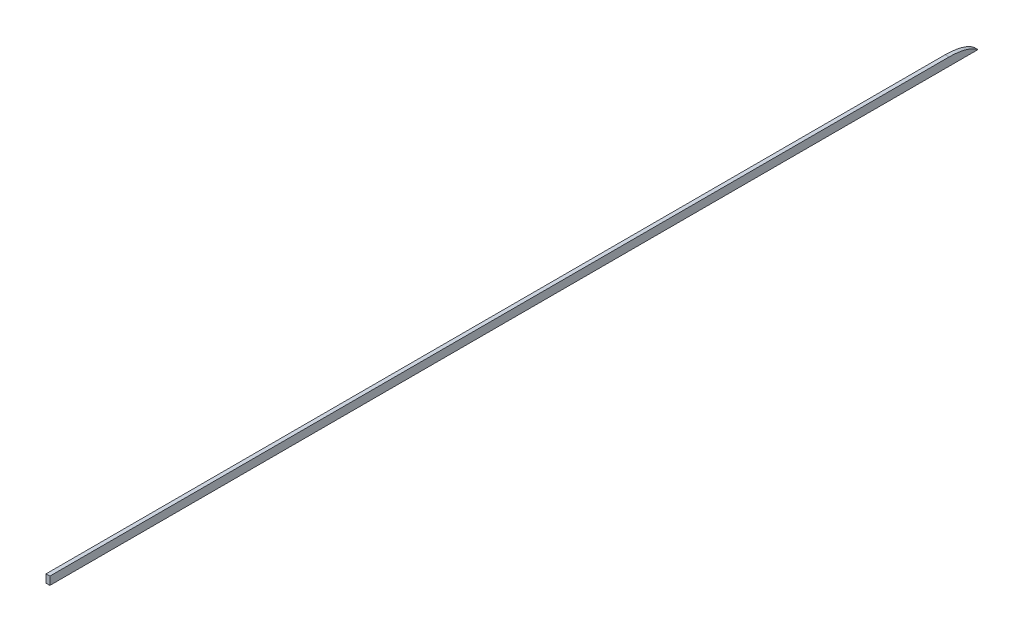
ISO-10303-21;
HEADER;
FILE_DESCRIPTION(('STEP AP214'),'2;1');
FILE_NAME('part.step','',(''),(''),'','','');
FILE_SCHEMA(('AUTOMOTIVE_DESIGN { 1 0 10303 214 1 1 1 1 }'));
ENDSEC;
DATA;
#1=APPLICATION_CONTEXT('core data for automotive mechanical design processes');
#2=APPLICATION_PROTOCOL_DEFINITION('international standard','automotive_design',2000,#1);
#3=PRODUCT_CONTEXT('',#1,'mechanical');
#4=PRODUCT('Part','Part','',(#3));
#5=PRODUCT_RELATED_PRODUCT_CATEGORY('part','',(#4));
#6=PRODUCT_DEFINITION_FORMATION('','',#4);
#7=PRODUCT_DEFINITION_CONTEXT('part definition',#1,'design');
#8=PRODUCT_DEFINITION('design','',#6,#7);
#9=PRODUCT_DEFINITION_SHAPE('','',#8);
#10=(LENGTH_UNIT() NAMED_UNIT(*) SI_UNIT(.MILLI.,.METRE.));
#11=(NAMED_UNIT(*) PLANE_ANGLE_UNIT() SI_UNIT($,.RADIAN.));
#12=(NAMED_UNIT(*) SI_UNIT($,.STERADIAN.) SOLID_ANGLE_UNIT());
#13=UNCERTAINTY_MEASURE_WITH_UNIT(LENGTH_MEASURE(1.E-05),#10,'distance_accuracy_value','');
#14=(GEOMETRIC_REPRESENTATION_CONTEXT(3) GLOBAL_UNCERTAINTY_ASSIGNED_CONTEXT((#13)) GLOBAL_UNIT_ASSIGNED_CONTEXT((#10,
#11,#12)) REPRESENTATION_CONTEXT('',''));
#15=CARTESIAN_POINT('',(0.,0.,0.));
#16=DIRECTION('',(0.,0.,1.));
#17=DIRECTION('',(1.,0.,0.));
#18=AXIS2_PLACEMENT_3D('',#15,#16,#17);
#19=CARTESIAN_POINT('',(1.27,0.,0.));
#20=DIRECTION('',(0.,0.,-1.));
#21=DIRECTION('',(-1.,0.,0.));
#22=AXIS2_PLACEMENT_3D('',#19,#20,#21);
#23=PLANE('',#22);
#24=DIRECTION('',(0.,-1.,0.));
#25=VECTOR('',#24,1.);
#26=CARTESIAN_POINT('',(0.,0.,0.));
#27=LINE('',#26,#25);
#28=CARTESIAN_POINT('',(0.,2.667,0.));
#29=VERTEX_POINT('',#28);
#30=CARTESIAN_POINT('',(0.,0.,0.));
#31=VERTEX_POINT('',#30);
#32=EDGE_CURVE('E115',#29,#31,#27,.T.);
#33=ORIENTED_EDGE('',*,*,#32,.T.);
#34=DIRECTION('',(-1.,0.,0.));
#35=VECTOR('',#34,1.);
#36=CARTESIAN_POINT('',(1.27,0.,0.));
#37=LINE('',#36,#35);
#38=CARTESIAN_POINT('',(1.27,0.,0.));
#39=VERTEX_POINT('',#38);
#40=EDGE_CURVE('E11',#39,#31,#37,.T.);
#41=ORIENTED_EDGE('',*,*,#40,.F.);
#42=DIRECTION('',(0.,-1.,0.));
#43=VECTOR('',#42,1.);
#44=CARTESIAN_POINT('',(1.27,0.,0.));
#45=LINE('',#44,#43);
#46=CARTESIAN_POINT('',(1.27,2.667,0.));
#47=VERTEX_POINT('',#46);
#48=EDGE_CURVE('E83',#47,#39,#45,.T.);
#49=ORIENTED_EDGE('',*,*,#48,.F.);
#50=DIRECTION('',(-1.,0.,0.));
#51=VECTOR('',#50,1.);
#52=CARTESIAN_POINT('',(1.27,2.667,0.));
#53=LINE('',#52,#51);
#54=EDGE_CURVE('E91',#47,#29,#53,.T.);
#55=ORIENTED_EDGE('',*,*,#54,.T.);
#56=EDGE_LOOP('',(#33,#41,#49,#55));
#57=FACE_BOUND('',#56,.T.);
#58=ADVANCED_FACE('F32',(#57),#23,.F.);
#59=CARTESIAN_POINT('',(1.27,0.,0.));
#60=DIRECTION('',(0.,1.,0.));
#61=DIRECTION('',(0.,0.,1.));
#62=AXIS2_PLACEMENT_3D('',#59,#60,#61);
#63=PLANE('',#62);
#64=DIRECTION('',(0.,0.,-1.));
#65=VECTOR('',#64,1.);
#66=CARTESIAN_POINT('',(0.,0.,0.));
#67=LINE('',#66,#65);
#68=CARTESIAN_POINT('',(0.,0.,-304.8));
#69=VERTEX_POINT('',#68);
#70=EDGE_CURVE('E87',#31,#69,#67,.T.);
#71=ORIENTED_EDGE('',*,*,#70,.T.);
#72=DIRECTION('',(-1.,0.,0.));
#73=VECTOR('',#72,1.);
#74=CARTESIAN_POINT('',(1.27,0.,-304.8));
#75=LINE('',#74,#73);
#76=CARTESIAN_POINT('',(1.27,0.,-304.8));
#77=VERTEX_POINT('',#76);
#78=EDGE_CURVE('E40',#77,#69,#75,.T.);
#79=ORIENTED_EDGE('',*,*,#78,.F.);
#80=DIRECTION('',(0.,0.,-1.));
#81=VECTOR('',#80,1.);
#82=CARTESIAN_POINT('',(1.27,0.,0.));
#83=LINE('',#82,#81);
#84=EDGE_CURVE('E78',#39,#77,#83,.T.);
#85=ORIENTED_EDGE('',*,*,#84,.F.);
#86=ORIENTED_EDGE('',*,*,#40,.T.);
#87=EDGE_LOOP('',(#71,#79,#85,#86));
#88=FACE_BOUND('',#87,.T.);
#89=ADVANCED_FACE('F86',(#88),#63,.F.);
#90=CARTESIAN_POINT('',(1.27,0.,-304.8));
#91=CARTESIAN_POINT('',(1.27,2.56681202963302,-301.604734919311));
#92=CARTESIAN_POINT('',(1.27,2.667,-295.275));
#93=B_SPLINE_CURVE_WITH_KNOTS('',2,(#90,#91,#92),.UNSPECIFIED.,.F.,.F.,(3,3),(0.,1.),.UNSPECIFIED.);
#94=DIRECTION('',(-1.,0.,0.));
#95=VECTOR('',#94,1.);
#96=SURFACE_OF_LINEAR_EXTRUSION('',#93,#95);
#97=CARTESIAN_POINT('',(0.,0.,-304.8));
#98=CARTESIAN_POINT('',(0.,2.56681202963302,-301.604734919311));
#99=CARTESIAN_POINT('',(0.,2.667,-295.275));
#100=B_SPLINE_CURVE_WITH_KNOTS('',2,(#97,#98,#99),.UNSPECIFIED.,.F.,.F.,(3,3),(0.,1.),.UNSPECIFIED.);
#101=CARTESIAN_POINT('',(0.,2.667,-295.275));
#102=VERTEX_POINT('',#101);
#103=EDGE_CURVE('E65',#69,#102,#100,.T.);
#104=ORIENTED_EDGE('',*,*,#103,.T.);
#105=DIRECTION('',(-1.,0.,0.));
#106=VECTOR('',#105,1.);
#107=CARTESIAN_POINT('',(1.27,2.667,-295.275));
#108=LINE('',#107,#106);
#109=CARTESIAN_POINT('',(1.27,2.667,-295.275));
#110=VERTEX_POINT('',#109);
#111=EDGE_CURVE('E88',#110,#102,#108,.T.);
#112=ORIENTED_EDGE('',*,*,#111,.F.);
#113=EDGE_CURVE('E81',#77,#110,#93,.T.);
#114=ORIENTED_EDGE('',*,*,#113,.F.);
#115=ORIENTED_EDGE('',*,*,#78,.T.);
#116=EDGE_LOOP('',(#104,#112,#114,#115));
#117=FACE_BOUND('',#116,.T.);
#118=ADVANCED_FACE('F89',(#117),#96,.F.);
#119=CARTESIAN_POINT('',(1.27,2.667,0.));
#120=DIRECTION('',(0.,-1.,0.));
#121=DIRECTION('',(0.,0.,-1.));
#122=AXIS2_PLACEMENT_3D('',#119,#120,#121);
#123=PLANE('',#122);
#124=DIRECTION('',(0.,0.,1.));
#125=VECTOR('',#124,1.);
#126=CARTESIAN_POINT('',(0.,2.667,0.));
#127=LINE('',#126,#125);
#128=EDGE_CURVE('E71',#102,#29,#127,.T.);
#129=ORIENTED_EDGE('',*,*,#128,.T.);
#130=ORIENTED_EDGE('',*,*,#54,.F.);
#131=DIRECTION('',(0.,0.,1.));
#132=VECTOR('',#131,1.);
#133=CARTESIAN_POINT('',(1.27,2.667,0.));
#134=LINE('',#133,#132);
#135=EDGE_CURVE('E48',#110,#47,#134,.T.);
#136=ORIENTED_EDGE('',*,*,#135,.F.);
#137=ORIENTED_EDGE('',*,*,#111,.T.);
#138=EDGE_LOOP('',(#129,#130,#136,#137));
#139=FACE_BOUND('',#138,.T.);
#140=ADVANCED_FACE('F104',(#139),#123,.F.);
#141=CARTESIAN_POINT('',(1.27,1.95015601481651,-300.821117459656));
#142=DIRECTION('',(-1.,0.,0.));
#143=DIRECTION('',(0.,0.,1.));
#144=AXIS2_PLACEMENT_3D('',#141,#142,#143);
#145=PLANE('',#144);
#146=ORIENTED_EDGE('',*,*,#48,.T.);
#147=ORIENTED_EDGE('',*,*,#84,.T.);
#148=ORIENTED_EDGE('',*,*,#113,.T.);
#149=ORIENTED_EDGE('',*,*,#135,.T.);
#150=EDGE_LOOP('',(#146,#147,#148,#149));
#151=FACE_BOUND('',#150,.T.);
#152=ADVANCED_FACE('F79',(#151),#145,.F.);
#153=CARTESIAN_POINT('',(0.,1.95015601481651,-300.821117459656));
#154=DIRECTION('',(-1.,0.,0.));
#155=DIRECTION('',(0.,0.,1.));
#156=AXIS2_PLACEMENT_3D('',#153,#154,#155);
#157=PLANE('',#156);
#158=ORIENTED_EDGE('',*,*,#32,.F.);
#159=ORIENTED_EDGE('',*,*,#128,.F.);
#160=ORIENTED_EDGE('',*,*,#103,.F.);
#161=ORIENTED_EDGE('',*,*,#70,.F.);
#162=EDGE_LOOP('',(#158,#159,#160,#161));
#163=FACE_BOUND('',#162,.T.);
#164=ADVANCED_FACE('F127',(#163),#157,.T.);
#165=CLOSED_SHELL('',(#58,#89,#118,#140,#152,#164));
#166=MANIFOLD_SOLID_BREP('B2',#165);
#167=ADVANCED_BREP_SHAPE_REPRESENTATION('',(#18,#166),#14);
#168=SHAPE_DEFINITION_REPRESENTATION(#9,#167);
ENDSEC;
END-ISO-10303-21;
